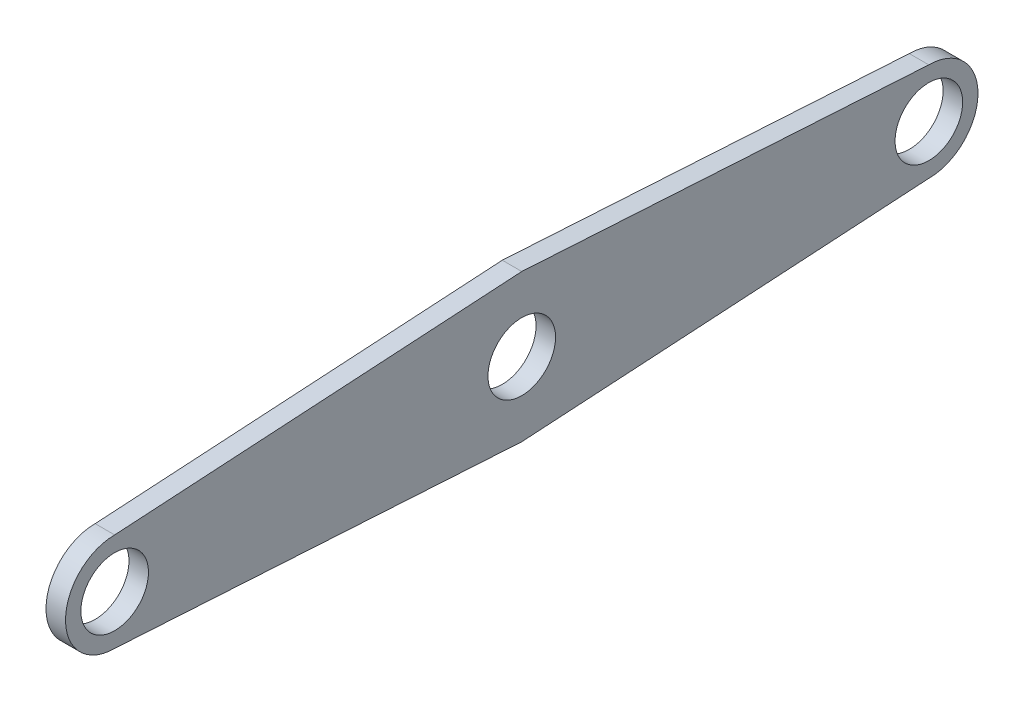
ISO-10303-21;
HEADER;
FILE_DESCRIPTION(('STEP AP214'),'2;1');
FILE_NAME('part.step','',(''),(''),'','','');
FILE_SCHEMA(('AUTOMOTIVE_DESIGN { 1 0 10303 214 1 1 1 1 }'));
ENDSEC;
DATA;
#1=APPLICATION_CONTEXT('core data for automotive mechanical design processes');
#2=APPLICATION_PROTOCOL_DEFINITION('international standard','automotive_design',2000,#1);
#3=PRODUCT_CONTEXT('',#1,'mechanical');
#4=PRODUCT('Part','Part','',(#3));
#5=PRODUCT_RELATED_PRODUCT_CATEGORY('part','',(#4));
#6=PRODUCT_DEFINITION_FORMATION('','',#4);
#7=PRODUCT_DEFINITION_CONTEXT('part definition',#1,'design');
#8=PRODUCT_DEFINITION('design','',#6,#7);
#9=PRODUCT_DEFINITION_SHAPE('','',#8);
#10=(LENGTH_UNIT() NAMED_UNIT(*) SI_UNIT(.MILLI.,.METRE.));
#11=(NAMED_UNIT(*) PLANE_ANGLE_UNIT() SI_UNIT($,.RADIAN.));
#12=(NAMED_UNIT(*) SI_UNIT($,.STERADIAN.) SOLID_ANGLE_UNIT());
#13=UNCERTAINTY_MEASURE_WITH_UNIT(LENGTH_MEASURE(1.E-05),#10,'distance_accuracy_value','');
#14=(GEOMETRIC_REPRESENTATION_CONTEXT(3) GLOBAL_UNCERTAINTY_ASSIGNED_CONTEXT((#13)) GLOBAL_UNIT_ASSIGNED_CONTEXT((#10,
#11,#12)) REPRESENTATION_CONTEXT('',''));
#15=CARTESIAN_POINT('',(0.,0.,0.));
#16=DIRECTION('',(0.,0.,1.));
#17=DIRECTION('',(1.,0.,0.));
#18=AXIS2_PLACEMENT_3D('',#15,#16,#17);
#19=CARTESIAN_POINT('',(6.35,-31.8837700940679,-1.92505781700034));
#20=DIRECTION('',(0.,0.9981822556225,0.0602676078866417));
#21=DIRECTION('',(0.,-0.0602676078866418,0.9981822556225));
#22=AXIS2_PLACEMENT_3D('',#19,#20,#21);
#23=PLANE('',#22);
#24=DIRECTION('',(0.,0.0602676078866418,-0.9981822556225));
#25=VECTOR('',#24,1.);
#26=CARTESIAN_POINT('',(0.,-31.8837700940679,-1.92505781700034));
#27=LINE('',#26,#25);
#28=CARTESIAN_POINT('',(0.,-24.,-132.5));
#29=VERTEX_POINT('',#28);
#30=CARTESIAN_POINT('',(0.,-16.,-265.));
#31=VERTEX_POINT('',#30);
#32=EDGE_CURVE('E130',#29,#31,#27,.T.);
#33=ORIENTED_EDGE('',*,*,#32,.T.);
#34=DIRECTION('',(-1.,0.,0.));
#35=VECTOR('',#34,1.);
#36=CARTESIAN_POINT('',(6.35,-16.,-265.));
#37=LINE('',#36,#35);
#38=CARTESIAN_POINT('',(6.35,-16.,-265.));
#39=VERTEX_POINT('',#38);
#40=EDGE_CURVE('E11',#39,#31,#37,.T.);
#41=ORIENTED_EDGE('',*,*,#40,.F.);
#42=DIRECTION('',(0.,0.0602676078866418,-0.9981822556225));
#43=VECTOR('',#42,1.);
#44=CARTESIAN_POINT('',(6.35,-31.8837700940679,-1.92505781700034));
#45=LINE('',#44,#43);
#46=CARTESIAN_POINT('',(6.35,-24.,-132.5));
#47=VERTEX_POINT('',#46);
#48=EDGE_CURVE('E155',#47,#39,#45,.T.);
#49=ORIENTED_EDGE('',*,*,#48,.F.);
#50=DIRECTION('',(-1.,0.,0.));
#51=VECTOR('',#50,1.);
#52=CARTESIAN_POINT('',(6.35,-24.,-132.5));
#53=LINE('',#52,#51);
#54=EDGE_CURVE('E120',#47,#29,#53,.T.);
#55=ORIENTED_EDGE('',*,*,#54,.T.);
#56=EDGE_LOOP('',(#33,#41,#49,#55));
#57=FACE_BOUND('',#56,.T.);
#58=ADVANCED_FACE('F36',(#57),#23,.F.);
#59=CARTESIAN_POINT('',(6.35,0.,-265.));
#60=DIRECTION('',(-1.,0.,0.));
#61=DIRECTION('',(0.,0.,1.));
#62=AXIS2_PLACEMENT_3D('',#59,#60,#61);
#63=CYLINDRICAL_SURFACE('',#62,16.);
#64=CARTESIAN_POINT('',(0.,0.,-265.));
#65=DIRECTION('',(1.,0.,0.));
#66=DIRECTION('',(0.,0.,-1.));
#67=AXIS2_PLACEMENT_3D('',#64,#65,#66);
#68=CIRCLE('',#67,16.);
#69=CARTESIAN_POINT('',(0.,16.,-265.));
#70=VERTEX_POINT('',#69);
#71=EDGE_CURVE('E133',#31,#70,#68,.T.);
#72=ORIENTED_EDGE('',*,*,#71,.T.);
#73=DIRECTION('',(-1.,0.,0.));
#74=VECTOR('',#73,1.);
#75=CARTESIAN_POINT('',(6.35,16.,-265.));
#76=LINE('',#75,#74);
#77=CARTESIAN_POINT('',(6.35,16.,-265.));
#78=VERTEX_POINT('',#77);
#79=EDGE_CURVE('E45',#78,#70,#76,.T.);
#80=ORIENTED_EDGE('',*,*,#79,.F.);
#81=CARTESIAN_POINT('',(6.35,0.,-265.));
#82=DIRECTION('',(1.,0.,0.));
#83=DIRECTION('',(0.,0.,-1.));
#84=AXIS2_PLACEMENT_3D('',#81,#82,#83);
#85=CIRCLE('',#84,16.);
#86=EDGE_CURVE('E89',#39,#78,#85,.T.);
#87=ORIENTED_EDGE('',*,*,#86,.F.);
#88=ORIENTED_EDGE('',*,*,#40,.T.);
#89=EDGE_LOOP('',(#72,#80,#87,#88));
#90=FACE_BOUND('',#89,.T.);
#91=ADVANCED_FACE('F148',(#90),#63,.T.);
#92=CARTESIAN_POINT('',(6.35,31.8837700940679,-1.92505781700032));
#93=DIRECTION('',(0.,0.9981822556225,-0.0602676078866414));
#94=DIRECTION('',(0.,0.0602676078866414,0.9981822556225));
#95=AXIS2_PLACEMENT_3D('',#92,#93,#94);
#96=PLANE('',#95);
#97=DIRECTION('',(0.,-0.0602676078866414,-0.9981822556225));
#98=VECTOR('',#97,1.);
#99=CARTESIAN_POINT('',(0.,31.8837700940679,-1.92505781700032));
#100=LINE('',#99,#98);
#101=CARTESIAN_POINT('',(0.,24.,-132.5));
#102=VERTEX_POINT('',#101);
#103=EDGE_CURVE('E136',#102,#70,#100,.T.);
#104=ORIENTED_EDGE('',*,*,#103,.F.);
#105=DIRECTION('',(-1.,0.,0.));
#106=VECTOR('',#105,1.);
#107=CARTESIAN_POINT('',(6.35,24.,-132.5));
#108=LINE('',#107,#106);
#109=CARTESIAN_POINT('',(6.35,24.,-132.5));
#110=VERTEX_POINT('',#109);
#111=EDGE_CURVE('E105',#110,#102,#108,.T.);
#112=ORIENTED_EDGE('',*,*,#111,.F.);
#113=DIRECTION('',(0.,-0.0602676078866414,-0.9981822556225));
#114=VECTOR('',#113,1.);
#115=CARTESIAN_POINT('',(6.35,31.8837700940679,-1.92505781700032));
#116=LINE('',#115,#114);
#117=EDGE_CURVE('E114',#110,#78,#116,.T.);
#118=ORIENTED_EDGE('',*,*,#117,.T.);
#119=ORIENTED_EDGE('',*,*,#79,.T.);
#120=EDGE_LOOP('',(#104,#112,#118,#119));
#121=FACE_BOUND('',#120,.T.);
#122=ADVANCED_FACE('F147',(#121),#96,.T.);
#123=CARTESIAN_POINT('',(6.35,15.941885047034,0.962528908500164));
#124=DIRECTION('',(0.,0.9981822556225,0.0602676078866416));
#125=DIRECTION('',(0.,-0.0602676078866416,0.9981822556225));
#126=AXIS2_PLACEMENT_3D('',#123,#124,#125);
#127=PLANE('',#126);
#128=DIRECTION('',(0.,0.0602676078866416,-0.9981822556225));
#129=VECTOR('',#128,1.);
#130=CARTESIAN_POINT('',(0.,15.941885047034,0.962528908500164));
#131=LINE('',#130,#129);
#132=CARTESIAN_POINT('',(0.,16.,0.));
#133=VERTEX_POINT('',#132);
#134=EDGE_CURVE('E104',#133,#102,#131,.T.);
#135=ORIENTED_EDGE('',*,*,#134,.F.);
#136=DIRECTION('',(-1.,0.,0.));
#137=VECTOR('',#136,1.);
#138=CARTESIAN_POINT('',(6.35,16.,0.));
#139=LINE('',#138,#137);
#140=CARTESIAN_POINT('',(6.35,16.,0.));
#141=VERTEX_POINT('',#140);
#142=EDGE_CURVE('E98',#141,#133,#139,.T.);
#143=ORIENTED_EDGE('',*,*,#142,.F.);
#144=DIRECTION('',(0.,0.0602676078866416,-0.9981822556225));
#145=VECTOR('',#144,1.);
#146=CARTESIAN_POINT('',(6.35,15.941885047034,0.962528908500164));
#147=LINE('',#146,#145);
#148=EDGE_CURVE('E102',#141,#110,#147,.T.);
#149=ORIENTED_EDGE('',*,*,#148,.T.);
#150=ORIENTED_EDGE('',*,*,#111,.T.);
#151=EDGE_LOOP('',(#135,#143,#149,#150));
#152=FACE_BOUND('',#151,.T.);
#153=ADVANCED_FACE('F100',(#152),#127,.T.);
#154=CARTESIAN_POINT('',(6.35,0.,0.));
#155=DIRECTION('',(-1.,0.,0.));
#156=DIRECTION('',(0.,0.,1.));
#157=AXIS2_PLACEMENT_3D('',#154,#155,#156);
#158=CYLINDRICAL_SURFACE('',#157,16.);
#159=CARTESIAN_POINT('',(0.,0.,0.));
#160=DIRECTION('',(1.,0.,0.));
#161=DIRECTION('',(0.,0.,-1.));
#162=AXIS2_PLACEMENT_3D('',#159,#160,#161);
#163=CIRCLE('',#162,16.);
#164=CARTESIAN_POINT('',(0.,-16.,0.));
#165=VERTEX_POINT('',#164);
#166=EDGE_CURVE('E75',#133,#165,#163,.T.);
#167=ORIENTED_EDGE('',*,*,#166,.T.);
#168=DIRECTION('',(-1.,0.,0.));
#169=VECTOR('',#168,1.);
#170=CARTESIAN_POINT('',(6.35,-16.,0.));
#171=LINE('',#170,#169);
#172=CARTESIAN_POINT('',(6.35,-16.,0.));
#173=VERTEX_POINT('',#172);
#174=EDGE_CURVE('E106',#173,#165,#171,.T.);
#175=ORIENTED_EDGE('',*,*,#174,.F.);
#176=CARTESIAN_POINT('',(6.35,0.,0.));
#177=DIRECTION('',(1.,0.,0.));
#178=DIRECTION('',(0.,0.,-1.));
#179=AXIS2_PLACEMENT_3D('',#176,#177,#178);
#180=CIRCLE('',#179,16.);
#181=EDGE_CURVE('E108',#141,#173,#180,.T.);
#182=ORIENTED_EDGE('',*,*,#181,.F.);
#183=ORIENTED_EDGE('',*,*,#142,.T.);
#184=EDGE_LOOP('',(#167,#175,#182,#183));
#185=FACE_BOUND('',#184,.T.);
#186=ADVANCED_FACE('F109',(#185),#158,.T.);
#187=CARTESIAN_POINT('',(6.35,0.,-265.));
#188=DIRECTION('',(-1.,0.,0.));
#189=DIRECTION('',(0.,0.,1.));
#190=AXIS2_PLACEMENT_3D('',#187,#188,#189);
#191=CYLINDRICAL_SURFACE('',#190,11.);
#192=CARTESIAN_POINT('',(6.35,0.,-265.));
#193=DIRECTION('',(1.,0.,0.));
#194=DIRECTION('',(0.,0.,-1.));
#195=AXIS2_PLACEMENT_3D('',#192,#193,#194);
#196=CIRCLE('',#195,11.);
#197=CARTESIAN_POINT('',(6.35,0.,-276.));
#198=VERTEX_POINT('',#197);
#199=EDGE_CURVE('E280',#198,#198,#196,.T.);
#200=ORIENTED_EDGE('',*,*,#199,.T.);
#201=EDGE_LOOP('',(#200));
#202=FACE_BOUND('',#201,.T.);
#203=CARTESIAN_POINT('',(0.,0.,-265.));
#204=DIRECTION('',(1.,0.,0.));
#205=DIRECTION('',(0.,0.,-1.));
#206=AXIS2_PLACEMENT_3D('',#203,#204,#205);
#207=CIRCLE('',#206,11.);
#208=CARTESIAN_POINT('',(0.,0.,-276.));
#209=VERTEX_POINT('',#208);
#210=EDGE_CURVE('E127',#209,#209,#207,.T.);
#211=ORIENTED_EDGE('',*,*,#210,.F.);
#212=EDGE_LOOP('',(#211));
#213=FACE_BOUND('',#212,.T.);
#214=ADVANCED_FACE('F177',(#202,#213),#191,.F.);
#215=CARTESIAN_POINT('',(6.35,0.,0.));
#216=DIRECTION('',(-1.,0.,0.));
#217=DIRECTION('',(0.,0.,1.));
#218=AXIS2_PLACEMENT_3D('',#215,#216,#217);
#219=CYLINDRICAL_SURFACE('',#218,11.);
#220=CARTESIAN_POINT('',(6.35,0.,0.));
#221=DIRECTION('',(1.,0.,0.));
#222=DIRECTION('',(0.,0.,-1.));
#223=AXIS2_PLACEMENT_3D('',#220,#221,#222);
#224=CIRCLE('',#223,11.);
#225=CARTESIAN_POINT('',(6.35,0.,-11.));
#226=VERTEX_POINT('',#225);
#227=EDGE_CURVE('E187',#226,#226,#224,.T.);
#228=ORIENTED_EDGE('',*,*,#227,.T.);
#229=EDGE_LOOP('',(#228));
#230=FACE_BOUND('',#229,.T.);
#231=CARTESIAN_POINT('',(0.,0.,0.));
#232=DIRECTION('',(1.,0.,0.));
#233=DIRECTION('',(0.,0.,-1.));
#234=AXIS2_PLACEMENT_3D('',#231,#232,#233);
#235=CIRCLE('',#234,11.);
#236=CARTESIAN_POINT('',(0.,0.,-11.));
#237=VERTEX_POINT('',#236);
#238=EDGE_CURVE('E124',#237,#237,#235,.T.);
#239=ORIENTED_EDGE('',*,*,#238,.F.);
#240=EDGE_LOOP('',(#239));
#241=FACE_BOUND('',#240,.T.);
#242=ADVANCED_FACE('F165',(#230,#241),#219,.F.);
#243=CARTESIAN_POINT('',(6.35,0.,-132.5));
#244=DIRECTION('',(-1.,0.,0.));
#245=DIRECTION('',(0.,0.,1.));
#246=AXIS2_PLACEMENT_3D('',#243,#244,#245);
#247=CYLINDRICAL_SURFACE('',#246,11.);
#248=CARTESIAN_POINT('',(6.35,0.,-132.5));
#249=DIRECTION('',(1.,0.,0.));
#250=DIRECTION('',(0.,0.,-1.));
#251=AXIS2_PLACEMENT_3D('',#248,#249,#250);
#252=CIRCLE('',#251,11.);
#253=CARTESIAN_POINT('',(6.35,0.,-143.5));
#254=VERTEX_POINT('',#253);
#255=EDGE_CURVE('E142',#254,#254,#252,.T.);
#256=ORIENTED_EDGE('',*,*,#255,.T.);
#257=EDGE_LOOP('',(#256));
#258=FACE_BOUND('',#257,.T.);
#259=CARTESIAN_POINT('',(0.,0.,-132.5));
#260=DIRECTION('',(1.,0.,0.));
#261=DIRECTION('',(0.,0.,-1.));
#262=AXIS2_PLACEMENT_3D('',#259,#260,#261);
#263=CIRCLE('',#262,11.);
#264=CARTESIAN_POINT('',(0.,0.,-143.5));
#265=VERTEX_POINT('',#264);
#266=EDGE_CURVE('E121',#265,#265,#263,.T.);
#267=ORIENTED_EDGE('',*,*,#266,.F.);
#268=EDGE_LOOP('',(#267));
#269=FACE_BOUND('',#268,.T.);
#270=ADVANCED_FACE('F38',(#258,#269),#247,.F.);
#271=CARTESIAN_POINT('',(6.35,-15.9418850470339,0.962528908500165));
#272=DIRECTION('',(0.,0.9981822556225,-0.0602676078866416));
#273=DIRECTION('',(0.,0.0602676078866416,0.9981822556225));
#274=AXIS2_PLACEMENT_3D('',#271,#272,#273);
#275=PLANE('',#274);
#276=DIRECTION('',(0.,-0.0602676078866416,-0.9981822556225));
#277=VECTOR('',#276,1.);
#278=CARTESIAN_POINT('',(0.,-15.9418850470339,0.962528908500165));
#279=LINE('',#278,#277);
#280=EDGE_CURVE('E81',#165,#29,#279,.T.);
#281=ORIENTED_EDGE('',*,*,#280,.T.);
#282=ORIENTED_EDGE('',*,*,#54,.F.);
#283=DIRECTION('',(0.,-0.0602676078866416,-0.9981822556225));
#284=VECTOR('',#283,1.);
#285=CARTESIAN_POINT('',(6.35,-15.9418850470339,0.962528908500165));
#286=LINE('',#285,#284);
#287=EDGE_CURVE('E53',#173,#47,#286,.T.);
#288=ORIENTED_EDGE('',*,*,#287,.F.);
#289=ORIENTED_EDGE('',*,*,#174,.T.);
#290=EDGE_LOOP('',(#281,#282,#288,#289));
#291=FACE_BOUND('',#290,.T.);
#292=ADVANCED_FACE('F156',(#291),#275,.F.);
#293=CARTESIAN_POINT('',(6.35,0.,0.));
#294=DIRECTION('',(1.,0.,0.));
#295=DIRECTION('',(0.,0.,-1.));
#296=AXIS2_PLACEMENT_3D('',#293,#294,#295);
#297=PLANE('',#296);
#298=ORIENTED_EDGE('',*,*,#255,.F.);
#299=EDGE_LOOP('',(#298));
#300=FACE_BOUND('',#299,.T.);
#301=ORIENTED_EDGE('',*,*,#227,.F.);
#302=EDGE_LOOP('',(#301));
#303=FACE_BOUND('',#302,.T.);
#304=ORIENTED_EDGE('',*,*,#199,.F.);
#305=EDGE_LOOP('',(#304));
#306=FACE_BOUND('',#305,.T.);
#307=ORIENTED_EDGE('',*,*,#48,.T.);
#308=ORIENTED_EDGE('',*,*,#86,.T.);
#309=ORIENTED_EDGE('',*,*,#117,.F.);
#310=ORIENTED_EDGE('',*,*,#148,.F.);
#311=ORIENTED_EDGE('',*,*,#181,.T.);
#312=ORIENTED_EDGE('',*,*,#287,.T.);
#313=EDGE_LOOP('',(#307,#308,#309,#310,#311,#312));
#314=FACE_BOUND('',#313,.T.);
#315=ADVANCED_FACE('F112',(#300,#303,#306,#314),#297,.T.);
#316=CARTESIAN_POINT('',(0.,0.,0.));
#317=DIRECTION('',(1.,0.,0.));
#318=DIRECTION('',(0.,0.,-1.));
#319=AXIS2_PLACEMENT_3D('',#316,#317,#318);
#320=PLANE('',#319);
#321=ORIENTED_EDGE('',*,*,#266,.T.);
#322=EDGE_LOOP('',(#321));
#323=FACE_BOUND('',#322,.T.);
#324=ORIENTED_EDGE('',*,*,#238,.T.);
#325=EDGE_LOOP('',(#324));
#326=FACE_BOUND('',#325,.T.);
#327=ORIENTED_EDGE('',*,*,#210,.T.);
#328=EDGE_LOOP('',(#327));
#329=FACE_BOUND('',#328,.T.);
#330=ORIENTED_EDGE('',*,*,#32,.F.);
#331=ORIENTED_EDGE('',*,*,#280,.F.);
#332=ORIENTED_EDGE('',*,*,#166,.F.);
#333=ORIENTED_EDGE('',*,*,#134,.T.);
#334=ORIENTED_EDGE('',*,*,#103,.T.);
#335=ORIENTED_EDGE('',*,*,#71,.F.);
#336=EDGE_LOOP('',(#330,#331,#332,#333,#334,#335));
#337=FACE_BOUND('',#336,.T.);
#338=ADVANCED_FACE('F152',(#323,#326,#329,#337),#320,.F.);
#339=CLOSED_SHELL('',(#58,#91,#122,#153,#186,#214,#242,#270,#292,#315,#338));
#340=MANIFOLD_SOLID_BREP('B2',#339);
#341=ADVANCED_BREP_SHAPE_REPRESENTATION('',(#18,#340),#14);
#342=SHAPE_DEFINITION_REPRESENTATION(#9,#341);
ENDSEC;
END-ISO-10303-21;
